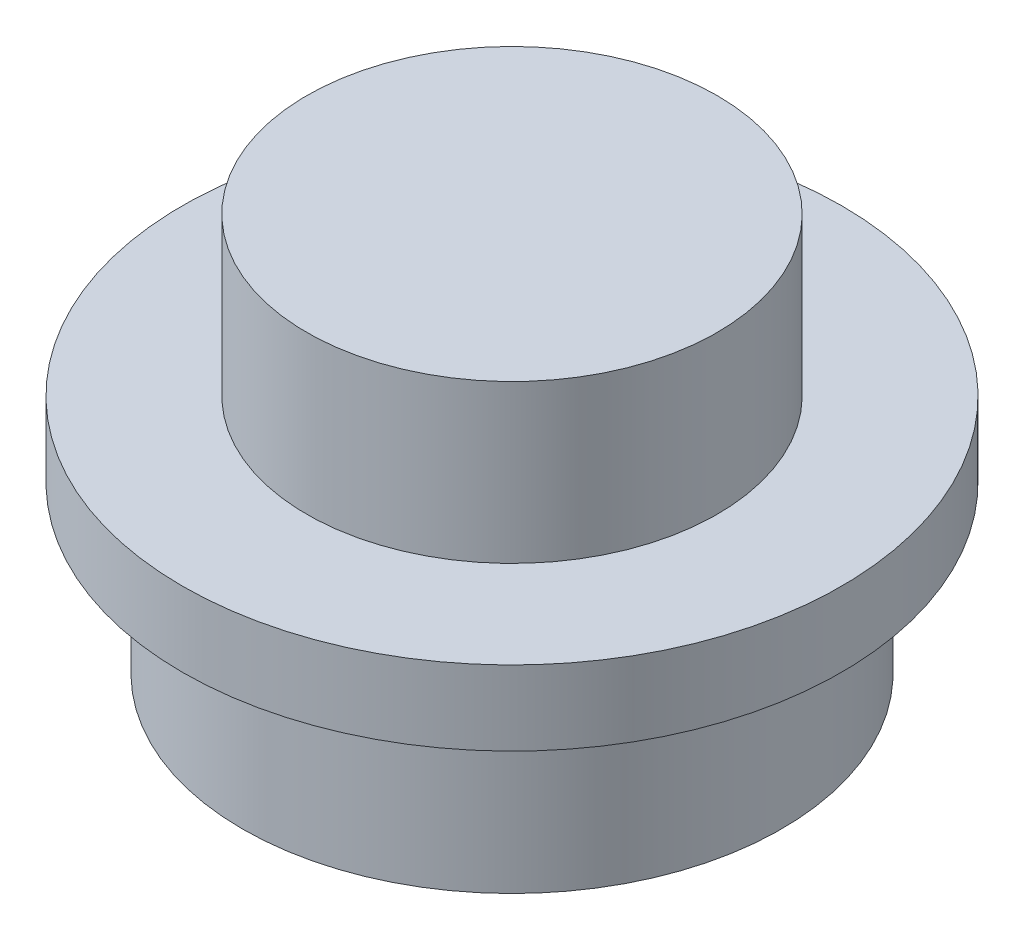
ISO-10303-21;
HEADER;
FILE_DESCRIPTION(('STEP AP214'),'2;1');
FILE_NAME('part.step','',(''),(''),'','','');
FILE_SCHEMA(('AUTOMOTIVE_DESIGN { 1 0 10303 214 1 1 1 1 }'));
ENDSEC;
DATA;
#1=APPLICATION_CONTEXT('core data for automotive mechanical design processes');
#2=APPLICATION_PROTOCOL_DEFINITION('international standard','automotive_design',2000,#1);
#3=PRODUCT_CONTEXT('',#1,'mechanical');
#4=PRODUCT('Part','Part','',(#3));
#5=PRODUCT_RELATED_PRODUCT_CATEGORY('part','',(#4));
#6=PRODUCT_DEFINITION_FORMATION('','',#4);
#7=PRODUCT_DEFINITION_CONTEXT('part definition',#1,'design');
#8=PRODUCT_DEFINITION('design','',#6,#7);
#9=PRODUCT_DEFINITION_SHAPE('','',#8);
#10=(LENGTH_UNIT() NAMED_UNIT(*) SI_UNIT(.MILLI.,.METRE.));
#11=(NAMED_UNIT(*) PLANE_ANGLE_UNIT() SI_UNIT($,.RADIAN.));
#12=(NAMED_UNIT(*) SI_UNIT($,.STERADIAN.) SOLID_ANGLE_UNIT());
#13=UNCERTAINTY_MEASURE_WITH_UNIT(LENGTH_MEASURE(1.E-05),#10,'distance_accuracy_value','');
#14=(GEOMETRIC_REPRESENTATION_CONTEXT(3) GLOBAL_UNCERTAINTY_ASSIGNED_CONTEXT((#13)) GLOBAL_UNIT_ASSIGNED_CONTEXT((#10,
#11,#12)) REPRESENTATION_CONTEXT('',''));
#15=CARTESIAN_POINT('',(0.,0.,0.));
#16=DIRECTION('',(0.,0.,1.));
#17=DIRECTION('',(1.,0.,0.));
#18=AXIS2_PLACEMENT_3D('',#15,#16,#17);
#19=CARTESIAN_POINT('',(-7.99165363807544,2.9,13.4053544896749));
#20=DIRECTION('',(0.,1.,0.));
#21=DIRECTION('',(0.,0.,1.));
#22=AXIS2_PLACEMENT_3D('',#19,#20,#21);
#23=PLANE('',#22);
#24=CARTESIAN_POINT('',(-7.99165363807544,2.9,13.4053544896749));
#25=DIRECTION('',(0.,1.,0.));
#26=DIRECTION('',(0.,0.,1.));
#27=AXIS2_PLACEMENT_3D('',#24,#25,#26);
#28=CIRCLE('',#27,3.975);
#29=CARTESIAN_POINT('',(-7.99165363807544,2.9,17.3803544896749));
#30=VERTEX_POINT('',#29);
#31=EDGE_CURVE('E48',#30,#30,#28,.T.);
#32=ORIENTED_EDGE('',*,*,#31,.T.);
#33=EDGE_LOOP('',(#32));
#34=FACE_BOUND('',#33,.T.);
#35=CARTESIAN_POINT('',(-7.99165363807544,2.9,13.4053544896749));
#36=DIRECTION('',(0.,1.,0.));
#37=DIRECTION('',(0.,0.,1.));
#38=AXIS2_PLACEMENT_3D('',#35,#36,#37);
#39=CIRCLE('',#38,2.475);
#40=CARTESIAN_POINT('',(-7.99165363807544,2.9,10.9303544896749));
#41=VERTEX_POINT('',#40);
#42=EDGE_CURVE('E55',#41,#41,#39,.T.);
#43=ORIENTED_EDGE('',*,*,#42,.F.);
#44=EDGE_LOOP('',(#43));
#45=FACE_BOUND('',#44,.T.);
#46=ADVANCED_FACE('F30',(#34,#45),#23,.T.);
#47=CARTESIAN_POINT('',(-7.99165363807544,0.,13.4053544896749));
#48=DIRECTION('',(0.,1.,0.));
#49=DIRECTION('',(0.,0.,1.));
#50=AXIS2_PLACEMENT_3D('',#47,#48,#49);
#51=PLANE('',#50);
#52=CARTESIAN_POINT('',(-7.99165363807544,0.,13.4053544896749));
#53=DIRECTION('',(0.,1.,0.));
#54=DIRECTION('',(0.,0.,1.));
#55=AXIS2_PLACEMENT_3D('',#52,#53,#54);
#56=CIRCLE('',#55,3.25);
#57=CARTESIAN_POINT('',(-7.99165363807544,0.,16.6553544896749));
#58=VERTEX_POINT('',#57);
#59=EDGE_CURVE('E34',#58,#58,#56,.T.);
#60=ORIENTED_EDGE('',*,*,#59,.F.);
#61=EDGE_LOOP('',(#60));
#62=FACE_BOUND('',#61,.T.);
#63=CARTESIAN_POINT('',(-7.99165363807544,0.,13.4053544896749));
#64=DIRECTION('',(0.,1.,0.));
#65=DIRECTION('',(0.,0.,1.));
#66=AXIS2_PLACEMENT_3D('',#63,#64,#65);
#67=CIRCLE('',#66,2.475);
#68=CARTESIAN_POINT('',(-7.99165363807544,0.,15.8803544896749));
#69=VERTEX_POINT('',#68);
#70=EDGE_CURVE('E41',#69,#69,#67,.T.);
#71=ORIENTED_EDGE('',*,*,#70,.T.);
#72=EDGE_LOOP('',(#71));
#73=FACE_BOUND('',#72,.T.);
#74=ADVANCED_FACE('F71',(#62,#73),#51,.F.);
#75=CARTESIAN_POINT('',(-7.99165363807544,2.,13.4053544896749));
#76=DIRECTION('',(0.,-1.,0.));
#77=DIRECTION('',(0.,0.,-1.));
#78=AXIS2_PLACEMENT_3D('',#75,#76,#77);
#79=CYLINDRICAL_SURFACE('',#78,3.25);
#80=CARTESIAN_POINT('',(-7.99165363807544,2.,13.4053544896749));
#81=DIRECTION('',(0.,1.,0.));
#82=DIRECTION('',(0.,0.,1.));
#83=AXIS2_PLACEMENT_3D('',#80,#81,#82);
#84=CIRCLE('',#83,3.25);
#85=CARTESIAN_POINT('',(-7.99165363807544,2.,16.6553544896749));
#86=VERTEX_POINT('',#85);
#87=EDGE_CURVE('E10',#86,#86,#84,.T.);
#88=ORIENTED_EDGE('',*,*,#87,.F.);
#89=EDGE_LOOP('',(#88));
#90=FACE_BOUND('',#89,.T.);
#91=ORIENTED_EDGE('',*,*,#59,.T.);
#92=EDGE_LOOP('',(#91));
#93=FACE_BOUND('',#92,.T.);
#94=ADVANCED_FACE('F32',(#90,#93),#79,.T.);
#95=CARTESIAN_POINT('',(-7.99165363807544,2.,13.4053544896749));
#96=DIRECTION('',(0.,-1.,0.));
#97=DIRECTION('',(0.,0.,-1.));
#98=AXIS2_PLACEMENT_3D('',#95,#96,#97);
#99=CYLINDRICAL_SURFACE('',#98,2.475);
#100=CARTESIAN_POINT('',(-7.99165363807544,2.,13.4053544896749));
#101=DIRECTION('',(0.,1.,0.));
#102=DIRECTION('',(0.,0.,1.));
#103=AXIS2_PLACEMENT_3D('',#100,#101,#102);
#104=CIRCLE('',#103,2.475);
#105=CARTESIAN_POINT('',(-7.99165363807544,2.,15.8803544896749));
#106=VERTEX_POINT('',#105);
#107=EDGE_CURVE('E45',#106,#106,#104,.T.);
#108=ORIENTED_EDGE('',*,*,#107,.T.);
#109=EDGE_LOOP('',(#108));
#110=FACE_BOUND('',#109,.T.);
#111=ORIENTED_EDGE('',*,*,#70,.F.);
#112=EDGE_LOOP('',(#111));
#113=FACE_BOUND('',#112,.T.);
#114=ADVANCED_FACE('F84',(#110,#113),#99,.F.);
#115=CARTESIAN_POINT('',(-7.99165363807544,2.,13.4053544896749));
#116=DIRECTION('',(0.,1.,0.));
#117=DIRECTION('',(0.,0.,1.));
#118=AXIS2_PLACEMENT_3D('',#115,#116,#117);
#119=PLANE('',#118);
#120=ORIENTED_EDGE('',*,*,#107,.F.);
#121=EDGE_LOOP('',(#120));
#122=FACE_BOUND('',#121,.T.);
#123=ADVANCED_FACE('F80',(#122),#119,.F.);
#124=CARTESIAN_POINT('',(-7.99165363807544,2.,13.4053544896749));
#125=DIRECTION('',(0.,1.,0.));
#126=DIRECTION('',(0.,0.,1.));
#127=AXIS2_PLACEMENT_3D('',#124,#125,#126);
#128=CIRCLE('',#127,3.975);
#129=CARTESIAN_POINT('',(-7.99165363807544,2.,17.3803544896749));
#130=VERTEX_POINT('',#129);
#131=EDGE_CURVE('E49',#130,#130,#128,.T.);
#132=ORIENTED_EDGE('',*,*,#131,.F.);
#133=EDGE_LOOP('',(#132));
#134=FACE_BOUND('',#133,.T.);
#135=ORIENTED_EDGE('',*,*,#87,.T.);
#136=EDGE_LOOP('',(#135));
#137=FACE_BOUND('',#136,.T.);
#138=ADVANCED_FACE('F83',(#134,#137),#119,.F.);
#139=CARTESIAN_POINT('',(-7.99165363807544,2.9,13.4053544896749));
#140=DIRECTION('',(0.,-1.,0.));
#141=DIRECTION('',(0.,0.,-1.));
#142=AXIS2_PLACEMENT_3D('',#139,#140,#141);
#143=CYLINDRICAL_SURFACE('',#142,3.975);
#144=ORIENTED_EDGE('',*,*,#31,.F.);
#145=EDGE_LOOP('',(#144));
#146=FACE_BOUND('',#145,.T.);
#147=ORIENTED_EDGE('',*,*,#131,.T.);
#148=EDGE_LOOP('',(#147));
#149=FACE_BOUND('',#148,.T.);
#150=ADVANCED_FACE('F66',(#146,#149),#143,.T.);
#151=CARTESIAN_POINT('',(-7.99165363807544,4.8,13.4053544896749));
#152=DIRECTION('',(0.,-1.,0.));
#153=DIRECTION('',(0.,0.,-1.));
#154=AXIS2_PLACEMENT_3D('',#151,#152,#153);
#155=CYLINDRICAL_SURFACE('',#154,2.475);
#156=CARTESIAN_POINT('',(-7.99165363807544,4.8,13.4053544896749));
#157=DIRECTION('',(0.,1.,0.));
#158=DIRECTION('',(0.,0.,1.));
#159=AXIS2_PLACEMENT_3D('',#156,#157,#158);
#160=CIRCLE('',#159,2.475);
#161=CARTESIAN_POINT('',(-7.99165363807544,4.8,10.9303544896749));
#162=VERTEX_POINT('',#161);
#163=EDGE_CURVE('E52',#162,#162,#160,.T.);
#164=CARTESIAN_POINT('',(-7.99165363807544,4.8,10.9303544896749));
#165=CARTESIAN_POINT('',(-7.99165363807544,4.78020833333333,10.9303544896749));
#166=CARTESIAN_POINT('',(-7.99165363807544,4.76041666666667,10.9303544896749));
#167=CARTESIAN_POINT('',(-7.99165363807544,4.72083333333333,10.9303544896749));
#168=CARTESIAN_POINT('',(-7.99165363807544,4.70104166666667,10.9303544896749));
#169=CARTESIAN_POINT('',(-7.99165363807544,4.66145833333333,10.9303544896749));
#170=CARTESIAN_POINT('',(-7.99165363807544,4.64166666666667,10.9303544896749));
#171=CARTESIAN_POINT('',(-7.99165363807544,4.60208333333333,10.9303544896749));
#172=CARTESIAN_POINT('',(-7.99165363807544,4.58229166666667,10.9303544896749));
#173=CARTESIAN_POINT('',(-7.99165363807544,4.54270833333333,10.9303544896749));
#174=CARTESIAN_POINT('',(-7.99165363807544,4.52291666666667,10.9303544896749));
#175=CARTESIAN_POINT('',(-7.99165363807544,4.48333333333333,10.9303544896749));
#176=CARTESIAN_POINT('',(-7.99165363807544,4.46354166666667,10.9303544896749));
#177=CARTESIAN_POINT('',(-7.99165363807544,4.42395833333333,10.9303544896749));
#178=CARTESIAN_POINT('',(-7.99165363807544,4.40416666666667,10.9303544896749));
#179=CARTESIAN_POINT('',(-7.99165363807544,4.36458333333333,10.9303544896749));
#180=CARTESIAN_POINT('',(-7.99165363807544,4.34479166666667,10.9303544896749));
#181=CARTESIAN_POINT('',(-7.99165363807544,4.30520833333333,10.9303544896749));
#182=CARTESIAN_POINT('',(-7.99165363807544,4.28541666666667,10.9303544896749));
#183=CARTESIAN_POINT('',(-7.99165363807544,4.24583333333333,10.9303544896749));
#184=CARTESIAN_POINT('',(-7.99165363807544,4.22604166666667,10.9303544896749));
#185=CARTESIAN_POINT('',(-7.99165363807544,4.18645833333333,10.9303544896749));
#186=CARTESIAN_POINT('',(-7.99165363807544,4.16666666666667,10.9303544896749));
#187=CARTESIAN_POINT('',(-7.99165363807544,4.12708333333333,10.9303544896749));
#188=CARTESIAN_POINT('',(-7.99165363807544,4.10729166666667,10.9303544896749));
#189=CARTESIAN_POINT('',(-7.99165363807544,4.06770833333333,10.9303544896749));
#190=CARTESIAN_POINT('',(-7.99165363807544,4.04791666666667,10.9303544896749));
#191=CARTESIAN_POINT('',(-7.99165363807544,4.00833333333333,10.9303544896749));
#192=CARTESIAN_POINT('',(-7.99165363807544,3.98854166666667,10.9303544896749));
#193=CARTESIAN_POINT('',(-7.99165363807544,3.94895833333333,10.9303544896749));
#194=CARTESIAN_POINT('',(-7.99165363807544,3.92916666666667,10.9303544896749));
#195=CARTESIAN_POINT('',(-7.99165363807544,3.88958333333333,10.9303544896749));
#196=CARTESIAN_POINT('',(-7.99165363807544,3.86979166666667,10.9303544896749));
#197=CARTESIAN_POINT('',(-7.99165363807544,3.83020833333333,10.9303544896749));
#198=CARTESIAN_POINT('',(-7.99165363807544,3.81041666666667,10.9303544896749));
#199=CARTESIAN_POINT('',(-7.99165363807544,3.77083333333333,10.9303544896749));
#200=CARTESIAN_POINT('',(-7.99165363807544,3.75104166666667,10.9303544896749));
#201=CARTESIAN_POINT('',(-7.99165363807544,3.71145833333333,10.9303544896749));
#202=CARTESIAN_POINT('',(-7.99165363807544,3.69166666666667,10.9303544896749));
#203=CARTESIAN_POINT('',(-7.99165363807544,3.65208333333333,10.9303544896749));
#204=CARTESIAN_POINT('',(-7.99165363807544,3.63229166666667,10.9303544896749));
#205=CARTESIAN_POINT('',(-7.99165363807544,3.59270833333333,10.9303544896749));
#206=CARTESIAN_POINT('',(-7.99165363807544,3.57291666666667,10.9303544896749));
#207=CARTESIAN_POINT('',(-7.99165363807544,3.53333333333333,10.9303544896749));
#208=CARTESIAN_POINT('',(-7.99165363807544,3.51354166666667,10.9303544896749));
#209=CARTESIAN_POINT('',(-7.99165363807544,3.47395833333333,10.9303544896749));
#210=CARTESIAN_POINT('',(-7.99165363807544,3.45416666666667,10.9303544896749));
#211=CARTESIAN_POINT('',(-7.99165363807544,3.41458333333333,10.9303544896749));
#212=CARTESIAN_POINT('',(-7.99165363807544,3.39479166666667,10.9303544896749));
#213=CARTESIAN_POINT('',(-7.99165363807544,3.35520833333333,10.9303544896749));
#214=CARTESIAN_POINT('',(-7.99165363807544,3.33541666666667,10.9303544896749));
#215=CARTESIAN_POINT('',(-7.99165363807544,3.29583333333333,10.9303544896749));
#216=CARTESIAN_POINT('',(-7.99165363807544,3.27604166666667,10.9303544896749));
#217=CARTESIAN_POINT('',(-7.99165363807544,3.23645833333333,10.9303544896749));
#218=CARTESIAN_POINT('',(-7.99165363807544,3.21666666666667,10.9303544896749));
#219=CARTESIAN_POINT('',(-7.99165363807544,3.17708333333333,10.9303544896749));
#220=CARTESIAN_POINT('',(-7.99165363807544,3.15729166666667,10.9303544896749));
#221=CARTESIAN_POINT('',(-7.99165363807544,3.11770833333333,10.9303544896749));
#222=CARTESIAN_POINT('',(-7.99165363807544,3.09791666666667,10.9303544896749));
#223=CARTESIAN_POINT('',(-7.99165363807544,3.05833333333333,10.9303544896749));
#224=CARTESIAN_POINT('',(-7.99165363807544,3.03854166666667,10.9303544896749));
#225=CARTESIAN_POINT('',(-7.99165363807544,2.99895833333333,10.9303544896749));
#226=CARTESIAN_POINT('',(-7.99165363807544,2.97916666666667,10.9303544896749));
#227=CARTESIAN_POINT('',(-7.99165363807544,2.93958333333333,10.9303544896749));
#228=CARTESIAN_POINT('',(-7.99165363807544,2.91979166666667,10.9303544896749));
#229=CARTESIAN_POINT('',(-7.99165363807544,2.9,10.9303544896749));
#230=B_SPLINE_CURVE_WITH_KNOTS('',3,(#164,#165,#166,#167,#168,#169,#170,#171,#172,#173,#174,
#175,#176,#177,#178,#179,#180,#181,#182,#183,#184,#185,#186,#187,#188,#189,#190,#191,#192,#193,
#194,#195,#196,#197,#198,#199,#200,#201,#202,#203,#204,#205,#206,#207,#208,#209,#210,#211,#212,
#213,#214,#215,#216,#217,#218,#219,#220,#221,#222,#223,#224,#225,#226,#227,#228,#229),
.UNSPECIFIED.,.F.,.F.,(4,2,2,2,2,2,2,2,2,2,2,2,2,2,2,2,2,2,2,2,2,2,2,2,2,2,2,2,2,2,2,2,4),(0.,
0.0593750000000004,0.118750000000001,0.178125,0.237500000000001,0.296875,0.356250000000001,
0.415625,0.475000000000001,0.534375,0.593750000000001,0.653125,0.7125,0.771875,0.83125,0.890625,
0.95,1.009375,1.06875,1.128125,1.1875,1.246875,1.30625,1.365625,1.425,1.484375,1.54375,1.603125,
1.6625,1.721875,1.78125,1.840625,1.9),.UNSPECIFIED.);
#231=EDGE_CURVE('BSEAM63',#162,#41,#230,.T.);
#232=ORIENTED_EDGE('',*,*,#163,.F.);
#233=ORIENTED_EDGE('',*,*,#42,.T.);
#234=ORIENTED_EDGE('',*,*,#231,.T.);
#235=ORIENTED_EDGE('',*,*,#231,.F.);
#236=EDGE_LOOP('',(#232,#234,#233,#235));
#237=FACE_BOUND('',#236,.T.);
#238=ADVANCED_FACE('F63',(#237),#155,.T.);
#239=CARTESIAN_POINT('',(-7.99165363807544,4.8,13.4053544896749));
#240=DIRECTION('',(0.,1.,0.));
#241=DIRECTION('',(0.,0.,1.));
#242=AXIS2_PLACEMENT_3D('',#239,#240,#241);
#243=PLANE('',#242);
#244=ORIENTED_EDGE('',*,*,#163,.T.);
#245=EDGE_LOOP('',(#244));
#246=FACE_BOUND('',#245,.T.);
#247=ADVANCED_FACE('F61',(#246),#243,.T.);
#248=CLOSED_SHELL('',(#46,#74,#94,#114,#123,#138,#150,#238,#247));
#249=MANIFOLD_SOLID_BREP('B2',#248);
#250=ADVANCED_BREP_SHAPE_REPRESENTATION('',(#18,#249),#14);
#251=SHAPE_DEFINITION_REPRESENTATION(#9,#250);
ENDSEC;
END-ISO-10303-21;
